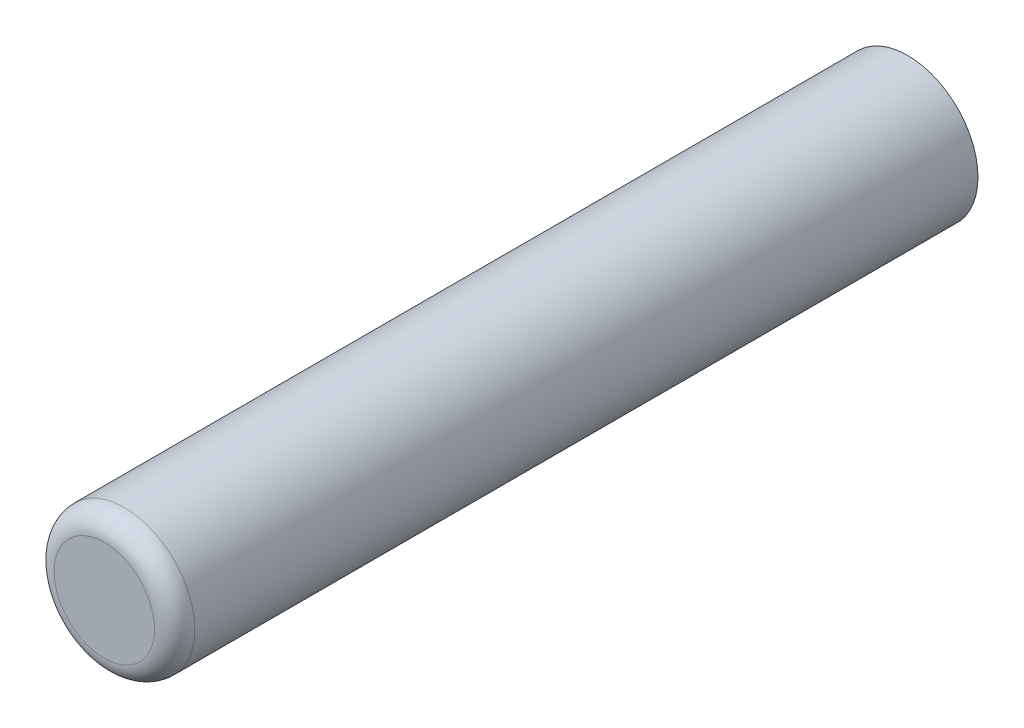
ISO-10303-21;
HEADER;
FILE_DESCRIPTION(('STEP AP214'),'2;1');
FILE_NAME('part.step','',(''),(''),'','','');
FILE_SCHEMA(('AUTOMOTIVE_DESIGN { 1 0 10303 214 1 1 1 1 }'));
ENDSEC;
DATA;
#1=APPLICATION_CONTEXT('core data for automotive mechanical design processes');
#2=APPLICATION_PROTOCOL_DEFINITION('international standard','automotive_design',2000,#1);
#3=PRODUCT_CONTEXT('',#1,'mechanical');
#4=PRODUCT('Part','Part','',(#3));
#5=PRODUCT_RELATED_PRODUCT_CATEGORY('part','',(#4));
#6=PRODUCT_DEFINITION_FORMATION('','',#4);
#7=PRODUCT_DEFINITION_CONTEXT('part definition',#1,'design');
#8=PRODUCT_DEFINITION('design','',#6,#7);
#9=PRODUCT_DEFINITION_SHAPE('','',#8);
#10=(LENGTH_UNIT() NAMED_UNIT(*) SI_UNIT(.MILLI.,.METRE.));
#11=(NAMED_UNIT(*) PLANE_ANGLE_UNIT() SI_UNIT($,.RADIAN.));
#12=(NAMED_UNIT(*) SI_UNIT($,.STERADIAN.) SOLID_ANGLE_UNIT());
#13=UNCERTAINTY_MEASURE_WITH_UNIT(LENGTH_MEASURE(1.E-05),#10,'distance_accuracy_value','');
#14=(GEOMETRIC_REPRESENTATION_CONTEXT(3) GLOBAL_UNCERTAINTY_ASSIGNED_CONTEXT((#13)) GLOBAL_UNIT_ASSIGNED_CONTEXT((#10,
#11,#12)) REPRESENTATION_CONTEXT('',''));
#15=CARTESIAN_POINT('',(0.,0.,0.));
#16=DIRECTION('',(0.,0.,1.));
#17=DIRECTION('',(1.,0.,0.));
#18=AXIS2_PLACEMENT_3D('',#15,#16,#17);
#19=CARTESIAN_POINT('',(0.,0.25,0.));
#20=DIRECTION('',(0.,0.,1.));
#21=DIRECTION('',(1.,0.,0.));
#22=AXIS2_PLACEMENT_3D('',#19,#20,#21);
#23=PLANE('',#22);
#24=CARTESIAN_POINT('',(0.,0.25,0.));
#25=DIRECTION('',(0.,0.,1.));
#26=DIRECTION('',(1.,0.,0.));
#27=AXIS2_PLACEMENT_3D('',#24,#25,#26);
#28=CIRCLE('',#27,1.75);
#29=CARTESIAN_POINT('',(1.75,0.25,0.));
#30=VERTEX_POINT('',#29);
#31=EDGE_CURVE('E71',#30,#30,#28,.T.);
#32=ORIENTED_EDGE('',*,*,#31,.F.);
#33=EDGE_LOOP('',(#32));
#34=FACE_BOUND('',#33,.T.);
#35=CARTESIAN_POINT('',(0.,0.25,0.));
#36=DIRECTION('',(0.,0.,1.));
#37=DIRECTION('',(1.,0.,0.));
#38=AXIS2_PLACEMENT_3D('',#35,#36,#37);
#39=CIRCLE('',#38,1.5);
#40=CARTESIAN_POINT('',(-1.1180339887499,1.25,0.));
#41=VERTEX_POINT('',#40);
#42=CARTESIAN_POINT('',(1.1180339887499,1.25,0.));
#43=VERTEX_POINT('',#42);
#44=EDGE_CURVE('E48',#41,#43,#39,.T.);
#45=ORIENTED_EDGE('',*,*,#44,.T.);
#46=DIRECTION('',(-1.,0.,0.));
#47=VECTOR('',#46,1.);
#48=CARTESIAN_POINT('',(1.1180339887499,1.25,0.));
#49=LINE('',#48,#47);
#50=EDGE_CURVE('E70',#43,#41,#49,.T.);
#51=ORIENTED_EDGE('',*,*,#50,.T.);
#52=EDGE_LOOP('',(#45,#51));
#53=FACE_BOUND('',#52,.T.);
#54=ADVANCED_FACE('F33',(#34,#53),#23,.F.);
#55=CARTESIAN_POINT('',(0.,0.25,9.3));
#56=DIRECTION('',(0.,0.,-1.));
#57=DIRECTION('',(-1.,0.,0.));
#58=AXIS2_PLACEMENT_3D('',#55,#56,#57);
#59=CYLINDRICAL_SURFACE('',#58,1.75);
#60=CARTESIAN_POINT('',(0.,0.25,19.5));
#61=DIRECTION('',(0.,0.,1.));
#62=DIRECTION('',(1.,0.,0.));
#63=AXIS2_PLACEMENT_3D('',#60,#61,#62);
#64=CIRCLE('',#63,1.75);
#65=CARTESIAN_POINT('',(1.75,0.25,19.5));
#66=VERTEX_POINT('',#65);
#67=EDGE_CURVE('E11',#66,#66,#64,.F.);
#68=ORIENTED_EDGE('',*,*,#67,.T.);
#69=EDGE_LOOP('',(#68));
#70=FACE_BOUND('',#69,.T.);
#71=ORIENTED_EDGE('',*,*,#31,.T.);
#72=EDGE_LOOP('',(#71));
#73=FACE_BOUND('',#72,.T.);
#74=ADVANCED_FACE('F93',(#70,#73),#59,.T.);
#75=CARTESIAN_POINT('',(0.,0.25,9.3));
#76=DIRECTION('',(0.,0.,-1.));
#77=DIRECTION('',(-1.,0.,0.));
#78=AXIS2_PLACEMENT_3D('',#75,#76,#77);
#79=CYLINDRICAL_SURFACE('',#78,1.5);
#80=ORIENTED_EDGE('',*,*,#44,.F.);
#81=DIRECTION('',(0.,0.,-1.));
#82=VECTOR('',#81,1.);
#83=CARTESIAN_POINT('',(-1.1180339887499,1.25,9.3));
#84=LINE('',#83,#82);
#85=CARTESIAN_POINT('',(-1.1180339887499,1.25,9.3));
#86=VERTEX_POINT('',#85);
#87=EDGE_CURVE('E65',#86,#41,#84,.T.);
#88=ORIENTED_EDGE('',*,*,#87,.F.);
#89=CARTESIAN_POINT('',(0.,0.25,9.3));
#90=DIRECTION('',(0.,0.,1.));
#91=DIRECTION('',(1.,0.,0.));
#92=AXIS2_PLACEMENT_3D('',#89,#90,#91);
#93=CIRCLE('',#92,1.5);
#94=CARTESIAN_POINT('',(1.1180339887499,1.25,9.3));
#95=VERTEX_POINT('',#94);
#96=EDGE_CURVE('E56',#86,#95,#93,.T.);
#97=ORIENTED_EDGE('',*,*,#96,.T.);
#98=DIRECTION('',(0.,0.,-1.));
#99=VECTOR('',#98,1.);
#100=CARTESIAN_POINT('',(1.1180339887499,1.25,9.3));
#101=LINE('',#100,#99);
#102=EDGE_CURVE('E67',#95,#43,#101,.T.);
#103=ORIENTED_EDGE('',*,*,#102,.T.);
#104=EDGE_LOOP('',(#80,#88,#97,#103));
#105=FACE_BOUND('',#104,.T.);
#106=ADVANCED_FACE('F73',(#105),#79,.F.);
#107=CARTESIAN_POINT('',(1.1180339887499,1.25,9.3));
#108=DIRECTION('',(0.,-1.,0.));
#109=DIRECTION('',(1.,0.,0.));
#110=AXIS2_PLACEMENT_3D('',#107,#108,#109);
#111=PLANE('',#110);
#112=ORIENTED_EDGE('',*,*,#50,.F.);
#113=ORIENTED_EDGE('',*,*,#102,.F.);
#114=DIRECTION('',(-1.,0.,0.));
#115=VECTOR('',#114,1.);
#116=CARTESIAN_POINT('',(1.1180339887499,1.25,9.3));
#117=LINE('',#116,#115);
#118=EDGE_CURVE('E61',#95,#86,#117,.T.);
#119=ORIENTED_EDGE('',*,*,#118,.T.);
#120=ORIENTED_EDGE('',*,*,#87,.T.);
#121=EDGE_LOOP('',(#112,#113,#119,#120));
#122=FACE_BOUND('',#121,.T.);
#123=ADVANCED_FACE('F68',(#122),#111,.T.);
#124=CARTESIAN_POINT('',(0.,0.25,9.3));
#125=DIRECTION('',(0.,0.,1.));
#126=DIRECTION('',(1.,0.,0.));
#127=AXIS2_PLACEMENT_3D('',#124,#125,#126);
#128=PLANE('',#127);
#129=ORIENTED_EDGE('',*,*,#96,.F.);
#130=ORIENTED_EDGE('',*,*,#118,.F.);
#131=EDGE_LOOP('',(#129,#130));
#132=FACE_BOUND('',#131,.T.);
#133=ADVANCED_FACE('F63',(#132),#128,.F.);
#134=CARTESIAN_POINT('',(0.,0.25,20.));
#135=DIRECTION('',(0.,0.,1.));
#136=DIRECTION('',(1.,0.,0.));
#137=AXIS2_PLACEMENT_3D('',#134,#135,#136);
#138=PLANE('',#137);
#139=CARTESIAN_POINT('',(0.,0.25,20.));
#140=DIRECTION('',(0.,0.,1.));
#141=DIRECTION('',(1.,0.,0.));
#142=AXIS2_PLACEMENT_3D('',#139,#140,#141);
#143=CIRCLE('',#142,1.25);
#144=CARTESIAN_POINT('',(1.25,0.25,20.));
#145=VERTEX_POINT('',#144);
#146=EDGE_CURVE('E41',#145,#145,#143,.T.);
#147=ORIENTED_EDGE('',*,*,#146,.T.);
#148=EDGE_LOOP('',(#147));
#149=FACE_BOUND('',#148,.T.);
#150=ADVANCED_FACE('F83',(#149),#138,.T.);
#151=CARTESIAN_POINT('',(0.,0.25,19.5));
#152=DIRECTION('',(0.,0.,1.));
#153=DIRECTION('',(1.,0.,0.));
#154=AXIS2_PLACEMENT_3D('',#151,#152,#153);
#155=TOROIDAL_SURFACE('',#154,1.25,0.5);
#156=ORIENTED_EDGE('',*,*,#67,.F.);
#157=EDGE_LOOP('',(#156));
#158=FACE_BOUND('',#157,.T.);
#159=ORIENTED_EDGE('',*,*,#146,.F.);
#160=EDGE_LOOP('',(#159));
#161=FACE_BOUND('',#160,.T.);
#162=ADVANCED_FACE('F35',(#158,#161),#155,.T.);
#163=CLOSED_SHELL('',(#54,#74,#106,#123,#133,#150,#162));
#164=MANIFOLD_SOLID_BREP('B2',#163);
#165=ADVANCED_BREP_SHAPE_REPRESENTATION('',(#18,#164),#14);
#166=SHAPE_DEFINITION_REPRESENTATION(#9,#165);
ENDSEC;
END-ISO-10303-21;
